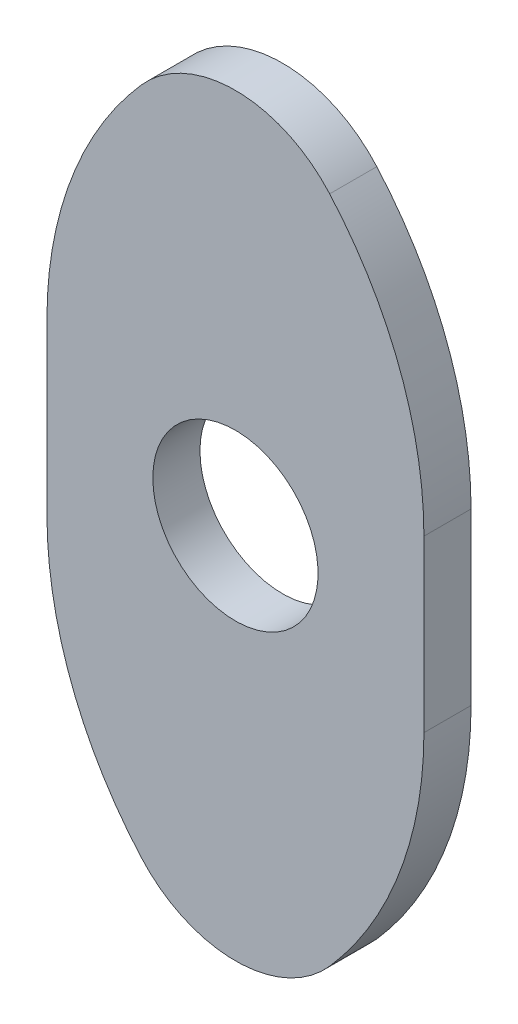
ISO-10303-21;
HEADER;
FILE_DESCRIPTION(('STEP AP214'),'2;1');
FILE_NAME('part.step','',(''),(''),'','','');
FILE_SCHEMA(('AUTOMOTIVE_DESIGN { 1 0 10303 214 1 1 1 1 }'));
ENDSEC;
DATA;
#1=APPLICATION_CONTEXT('core data for automotive mechanical design processes');
#2=APPLICATION_PROTOCOL_DEFINITION('international standard','automotive_design',2000,#1);
#3=PRODUCT_CONTEXT('',#1,'mechanical');
#4=PRODUCT('Part','Part','',(#3));
#5=PRODUCT_RELATED_PRODUCT_CATEGORY('part','',(#4));
#6=PRODUCT_DEFINITION_FORMATION('','',#4);
#7=PRODUCT_DEFINITION_CONTEXT('part definition',#1,'design');
#8=PRODUCT_DEFINITION('design','',#6,#7);
#9=PRODUCT_DEFINITION_SHAPE('','',#8);
#10=(LENGTH_UNIT() NAMED_UNIT(*) SI_UNIT(.MILLI.,.METRE.));
#11=(NAMED_UNIT(*) PLANE_ANGLE_UNIT() SI_UNIT($,.RADIAN.));
#12=(NAMED_UNIT(*) SI_UNIT($,.STERADIAN.) SOLID_ANGLE_UNIT());
#13=UNCERTAINTY_MEASURE_WITH_UNIT(LENGTH_MEASURE(1.E-05),#10,'distance_accuracy_value','');
#14=(GEOMETRIC_REPRESENTATION_CONTEXT(3) GLOBAL_UNCERTAINTY_ASSIGNED_CONTEXT((#13)) GLOBAL_UNIT_ASSIGNED_CONTEXT((#10,
#11,#12)) REPRESENTATION_CONTEXT('',''));
#15=CARTESIAN_POINT('',(0.,0.,0.));
#16=DIRECTION('',(0.,0.,1.));
#17=DIRECTION('',(1.,0.,0.));
#18=AXIS2_PLACEMENT_3D('',#15,#16,#17);
#19=CARTESIAN_POINT('',(-19.05,8.59947917473986,4.7625));
#20=DIRECTION('',(0.,0.,1.));
#21=DIRECTION('',(1.,0.,0.));
#22=AXIS2_PLACEMENT_3D('',#19,#20,#21);
#23=PLANE('',#22);
#24=CARTESIAN_POINT('',(-19.05,8.59947917473986,4.7625));
#25=DIRECTION('',(0.,0.,1.));
#26=DIRECTION('',(1.,0.,0.));
#27=AXIS2_PLACEMENT_3D('',#24,#25,#26);
#28=CIRCLE('',#27,38.1);
#29=CARTESIAN_POINT('',(19.05,8.59947917473985,4.7625));
#30=VERTEX_POINT('',#29);
#31=CARTESIAN_POINT('',(9.52500000000001,33.8002604126301,4.7625));
#32=VERTEX_POINT('',#31);
#33=EDGE_CURVE('E138',#30,#32,#28,.T.);
#34=ORIENTED_EDGE('',*,*,#33,.T.);
#35=CARTESIAN_POINT('',(0.,25.4,4.7625));
#36=DIRECTION('',(0.,0.,1.));
#37=DIRECTION('',(1.,0.,0.));
#38=AXIS2_PLACEMENT_3D('',#35,#36,#37);
#39=CIRCLE('',#38,12.7);
#40=CARTESIAN_POINT('',(-9.52500000000001,33.8002604126301,4.7625));
#41=VERTEX_POINT('',#40);
#42=EDGE_CURVE('E115',#32,#41,#39,.T.);
#43=ORIENTED_EDGE('',*,*,#42,.T.);
#44=CARTESIAN_POINT('',(19.05,8.59947917473986,4.7625));
#45=DIRECTION('',(0.,0.,1.));
#46=DIRECTION('',(-1.,0.,0.));
#47=AXIS2_PLACEMENT_3D('',#44,#45,#46);
#48=CIRCLE('',#47,38.1);
#49=CARTESIAN_POINT('',(-19.05,8.59947917473985,4.7625));
#50=VERTEX_POINT('',#49);
#51=EDGE_CURVE('E141',#41,#50,#48,.T.);
#52=ORIENTED_EDGE('',*,*,#51,.T.);
#53=DIRECTION('',(0.,-1.,0.));
#54=VECTOR('',#53,1.);
#55=CARTESIAN_POINT('',(-19.05,8.59947917473985,4.7625));
#56=LINE('',#55,#54);
#57=CARTESIAN_POINT('',(-19.05,-8.59947917473986,4.7625));
#58=VERTEX_POINT('',#57);
#59=EDGE_CURVE('E143',#50,#58,#56,.T.);
#60=ORIENTED_EDGE('',*,*,#59,.T.);
#61=CARTESIAN_POINT('',(19.05,-8.59947917473986,4.7625));
#62=DIRECTION('',(0.,0.,1.));
#63=DIRECTION('',(1.,0.,0.));
#64=AXIS2_PLACEMENT_3D('',#61,#62,#63);
#65=CIRCLE('',#64,38.1);
#66=CARTESIAN_POINT('',(-9.525,-33.8002604126301,4.7625));
#67=VERTEX_POINT('',#66);
#68=EDGE_CURVE('E145',#58,#67,#65,.T.);
#69=ORIENTED_EDGE('',*,*,#68,.T.);
#70=CARTESIAN_POINT('',(0.,-25.4,4.7625));
#71=DIRECTION('',(0.,0.,1.));
#72=DIRECTION('',(-1.,0.,0.));
#73=AXIS2_PLACEMENT_3D('',#70,#71,#72);
#74=CIRCLE('',#73,12.7);
#75=CARTESIAN_POINT('',(9.52500000000002,-33.8002604126301,4.7625));
#76=VERTEX_POINT('',#75);
#77=EDGE_CURVE('E147',#67,#76,#74,.T.);
#78=ORIENTED_EDGE('',*,*,#77,.T.);
#79=CARTESIAN_POINT('',(-19.05,-8.59947917473987,4.7625));
#80=DIRECTION('',(0.,0.,1.));
#81=DIRECTION('',(-1.,0.,0.));
#82=AXIS2_PLACEMENT_3D('',#79,#80,#81);
#83=CIRCLE('',#82,38.1);
#84=CARTESIAN_POINT('',(19.05,-8.59947917473985,4.7625));
#85=VERTEX_POINT('',#84);
#86=EDGE_CURVE('E56',#76,#85,#83,.T.);
#87=ORIENTED_EDGE('',*,*,#86,.T.);
#88=DIRECTION('',(0.,1.,0.));
#89=VECTOR('',#88,1.);
#90=CARTESIAN_POINT('',(19.05,8.59947917473985,4.7625));
#91=LINE('',#90,#89);
#92=EDGE_CURVE('E51',#85,#30,#91,.T.);
#93=ORIENTED_EDGE('',*,*,#92,.T.);
#94=EDGE_LOOP('',(#34,#43,#52,#60,#69,#78,#87,#93));
#95=FACE_BOUND('',#94,.T.);
#96=CARTESIAN_POINT('',(0.,0.,4.7625));
#97=DIRECTION('',(0.,0.,1.));
#98=DIRECTION('',(1.,0.,0.));
#99=AXIS2_PLACEMENT_3D('',#96,#97,#98);
#100=CIRCLE('',#99,8.35025);
#101=CARTESIAN_POINT('',(-8.35025,0.,4.7625));
#102=VERTEX_POINT('',#101);
#103=EDGE_CURVE('E120',#102,#102,#100,.T.);
#104=ORIENTED_EDGE('',*,*,#103,.F.);
#105=EDGE_LOOP('',(#104));
#106=FACE_BOUND('',#105,.T.);
#107=ADVANCED_FACE('F36',(#95,#106),#23,.T.);
#108=CARTESIAN_POINT('',(-19.05,8.59947917473986,0.));
#109=DIRECTION('',(0.,0.,1.));
#110=DIRECTION('',(1.,0.,0.));
#111=AXIS2_PLACEMENT_3D('',#108,#109,#110);
#112=PLANE('',#111);
#113=CARTESIAN_POINT('',(-19.05,8.59947917473986,0.));
#114=DIRECTION('',(0.,0.,1.));
#115=DIRECTION('',(1.,0.,0.));
#116=AXIS2_PLACEMENT_3D('',#113,#114,#115);
#117=CIRCLE('',#116,38.1);
#118=CARTESIAN_POINT('',(19.05,8.59947917473985,0.));
#119=VERTEX_POINT('',#118);
#120=CARTESIAN_POINT('',(9.52500000000001,33.8002604126301,0.));
#121=VERTEX_POINT('',#120);
#122=EDGE_CURVE('E106',#119,#121,#117,.T.);
#123=ORIENTED_EDGE('',*,*,#122,.F.);
#124=DIRECTION('',(0.,1.,0.));
#125=VECTOR('',#124,1.);
#126=CARTESIAN_POINT('',(19.05,8.59947917473985,0.));
#127=LINE('',#126,#125);
#128=CARTESIAN_POINT('',(19.05,-8.59947917473985,0.));
#129=VERTEX_POINT('',#128);
#130=EDGE_CURVE('E136',#129,#119,#127,.T.);
#131=ORIENTED_EDGE('',*,*,#130,.F.);
#132=CARTESIAN_POINT('',(-19.05,-8.59947917473987,0.));
#133=DIRECTION('',(0.,0.,1.));
#134=DIRECTION('',(-1.,0.,0.));
#135=AXIS2_PLACEMENT_3D('',#132,#133,#134);
#136=CIRCLE('',#135,38.1);
#137=CARTESIAN_POINT('',(9.52500000000002,-33.8002604126301,0.));
#138=VERTEX_POINT('',#137);
#139=EDGE_CURVE('E134',#138,#129,#136,.T.);
#140=ORIENTED_EDGE('',*,*,#139,.F.);
#141=CARTESIAN_POINT('',(0.,-25.4,0.));
#142=DIRECTION('',(0.,0.,1.));
#143=DIRECTION('',(-1.,0.,0.));
#144=AXIS2_PLACEMENT_3D('',#141,#142,#143);
#145=CIRCLE('',#144,12.7);
#146=CARTESIAN_POINT('',(-9.525,-33.8002604126301,0.));
#147=VERTEX_POINT('',#146);
#148=EDGE_CURVE('E132',#147,#138,#145,.T.);
#149=ORIENTED_EDGE('',*,*,#148,.F.);
#150=CARTESIAN_POINT('',(19.05,-8.59947917473986,0.));
#151=DIRECTION('',(0.,0.,1.));
#152=DIRECTION('',(1.,0.,0.));
#153=AXIS2_PLACEMENT_3D('',#150,#151,#152);
#154=CIRCLE('',#153,38.1);
#155=CARTESIAN_POINT('',(-19.05,-8.59947917473986,0.));
#156=VERTEX_POINT('',#155);
#157=EDGE_CURVE('E130',#156,#147,#154,.T.);
#158=ORIENTED_EDGE('',*,*,#157,.F.);
#159=DIRECTION('',(0.,-1.,0.));
#160=VECTOR('',#159,1.);
#161=CARTESIAN_POINT('',(-19.05,8.59947917473985,0.));
#162=LINE('',#161,#160);
#163=CARTESIAN_POINT('',(-19.05,8.59947917473985,0.));
#164=VERTEX_POINT('',#163);
#165=EDGE_CURVE('E128',#164,#156,#162,.T.);
#166=ORIENTED_EDGE('',*,*,#165,.F.);
#167=CARTESIAN_POINT('',(19.05,8.59947917473986,0.));
#168=DIRECTION('',(0.,0.,1.));
#169=DIRECTION('',(-1.,0.,0.));
#170=AXIS2_PLACEMENT_3D('',#167,#168,#169);
#171=CIRCLE('',#170,38.1);
#172=CARTESIAN_POINT('',(-9.52500000000001,33.8002604126301,0.));
#173=VERTEX_POINT('',#172);
#174=EDGE_CURVE('E108',#173,#164,#171,.T.);
#175=ORIENTED_EDGE('',*,*,#174,.F.);
#176=CARTESIAN_POINT('',(0.,25.4,0.));
#177=DIRECTION('',(0.,0.,1.));
#178=DIRECTION('',(1.,0.,0.));
#179=AXIS2_PLACEMENT_3D('',#176,#177,#178);
#180=CIRCLE('',#179,12.7);
#181=EDGE_CURVE('E101',#121,#173,#180,.T.);
#182=ORIENTED_EDGE('',*,*,#181,.F.);
#183=EDGE_LOOP('',(#123,#131,#140,#149,#158,#166,#175,#182));
#184=FACE_BOUND('',#183,.T.);
#185=CARTESIAN_POINT('',(0.,0.,0.));
#186=DIRECTION('',(0.,0.,1.));
#187=DIRECTION('',(1.,0.,0.));
#188=AXIS2_PLACEMENT_3D('',#185,#186,#187);
#189=CIRCLE('',#188,8.35025);
#190=CARTESIAN_POINT('',(-8.35025,0.,0.));
#191=VERTEX_POINT('',#190);
#192=EDGE_CURVE('E123',#191,#191,#189,.T.);
#193=ORIENTED_EDGE('',*,*,#192,.T.);
#194=EDGE_LOOP('',(#193));
#195=FACE_BOUND('',#194,.T.);
#196=ADVANCED_FACE('F102',(#184,#195),#112,.F.);
#197=CARTESIAN_POINT('',(-19.05,8.59947917473986,4.7625));
#198=DIRECTION('',(0.,0.,-1.));
#199=DIRECTION('',(-1.,0.,0.));
#200=AXIS2_PLACEMENT_3D('',#197,#198,#199);
#201=CYLINDRICAL_SURFACE('',#200,38.1);
#202=ORIENTED_EDGE('',*,*,#122,.T.);
#203=DIRECTION('',(0.,0.,-1.));
#204=VECTOR('',#203,1.);
#205=CARTESIAN_POINT('',(9.52500000000001,33.8002604126301,4.7625));
#206=LINE('',#205,#204);
#207=EDGE_CURVE('E11',#32,#121,#206,.T.);
#208=ORIENTED_EDGE('',*,*,#207,.F.);
#209=ORIENTED_EDGE('',*,*,#33,.F.);
#210=DIRECTION('',(0.,0.,-1.));
#211=VECTOR('',#210,1.);
#212=CARTESIAN_POINT('',(19.05,8.59947917473985,4.7625));
#213=LINE('',#212,#211);
#214=EDGE_CURVE('E119',#30,#119,#213,.T.);
#215=ORIENTED_EDGE('',*,*,#214,.T.);
#216=EDGE_LOOP('',(#202,#208,#209,#215));
#217=FACE_BOUND('',#216,.T.);
#218=ADVANCED_FACE('F38',(#217),#201,.T.);
#219=CARTESIAN_POINT('',(0.,25.4,4.7625));
#220=DIRECTION('',(0.,0.,-1.));
#221=DIRECTION('',(-1.,0.,0.));
#222=AXIS2_PLACEMENT_3D('',#219,#220,#221);
#223=CYLINDRICAL_SURFACE('',#222,12.7);
#224=ORIENTED_EDGE('',*,*,#181,.T.);
#225=DIRECTION('',(0.,0.,-1.));
#226=VECTOR('',#225,1.);
#227=CARTESIAN_POINT('',(-9.52500000000001,33.8002604126301,4.7625));
#228=LINE('',#227,#226);
#229=EDGE_CURVE('E44',#41,#173,#228,.T.);
#230=ORIENTED_EDGE('',*,*,#229,.F.);
#231=ORIENTED_EDGE('',*,*,#42,.F.);
#232=ORIENTED_EDGE('',*,*,#207,.T.);
#233=EDGE_LOOP('',(#224,#230,#231,#232));
#234=FACE_BOUND('',#233,.T.);
#235=ADVANCED_FACE('F114',(#234),#223,.T.);
#236=CARTESIAN_POINT('',(19.05,8.59947917473986,4.7625));
#237=DIRECTION('',(0.,0.,-1.));
#238=DIRECTION('',(-1.,0.,0.));
#239=AXIS2_PLACEMENT_3D('',#236,#237,#238);
#240=CYLINDRICAL_SURFACE('',#239,38.1);
#241=ORIENTED_EDGE('',*,*,#174,.T.);
#242=DIRECTION('',(0.,0.,-1.));
#243=VECTOR('',#242,1.);
#244=CARTESIAN_POINT('',(-19.05,8.59947917473985,4.7625));
#245=LINE('',#244,#243);
#246=EDGE_CURVE('E164',#50,#164,#245,.T.);
#247=ORIENTED_EDGE('',*,*,#246,.F.);
#248=ORIENTED_EDGE('',*,*,#51,.F.);
#249=ORIENTED_EDGE('',*,*,#229,.T.);
#250=EDGE_LOOP('',(#241,#247,#248,#249));
#251=FACE_BOUND('',#250,.T.);
#252=ADVANCED_FACE('F168',(#251),#240,.T.);
#253=CARTESIAN_POINT('',(-19.05,8.59947917473985,4.7625));
#254=DIRECTION('',(1.,0.,0.));
#255=DIRECTION('',(0.,0.,-1.));
#256=AXIS2_PLACEMENT_3D('',#253,#254,#255);
#257=PLANE('',#256);
#258=ORIENTED_EDGE('',*,*,#165,.T.);
#259=DIRECTION('',(0.,0.,-1.));
#260=VECTOR('',#259,1.);
#261=CARTESIAN_POINT('',(-19.05,-8.59947917473986,4.7625));
#262=LINE('',#261,#260);
#263=EDGE_CURVE('E161',#58,#156,#262,.T.);
#264=ORIENTED_EDGE('',*,*,#263,.F.);
#265=ORIENTED_EDGE('',*,*,#59,.F.);
#266=ORIENTED_EDGE('',*,*,#246,.T.);
#267=EDGE_LOOP('',(#258,#264,#265,#266));
#268=FACE_BOUND('',#267,.T.);
#269=ADVANCED_FACE('F176',(#268),#257,.F.);
#270=CARTESIAN_POINT('',(19.05,-8.59947917473986,4.7625));
#271=DIRECTION('',(0.,0.,-1.));
#272=DIRECTION('',(-1.,0.,0.));
#273=AXIS2_PLACEMENT_3D('',#270,#271,#272);
#274=CYLINDRICAL_SURFACE('',#273,38.1);
#275=ORIENTED_EDGE('',*,*,#157,.T.);
#276=DIRECTION('',(0.,0.,-1.));
#277=VECTOR('',#276,1.);
#278=CARTESIAN_POINT('',(-9.525,-33.8002604126301,4.7625));
#279=LINE('',#278,#277);
#280=EDGE_CURVE('E158',#67,#147,#279,.T.);
#281=ORIENTED_EDGE('',*,*,#280,.F.);
#282=ORIENTED_EDGE('',*,*,#68,.F.);
#283=ORIENTED_EDGE('',*,*,#263,.T.);
#284=EDGE_LOOP('',(#275,#281,#282,#283));
#285=FACE_BOUND('',#284,.T.);
#286=ADVANCED_FACE('F179',(#285),#274,.T.);
#287=CARTESIAN_POINT('',(0.,-25.4,4.7625));
#288=DIRECTION('',(0.,0.,-1.));
#289=DIRECTION('',(-1.,0.,0.));
#290=AXIS2_PLACEMENT_3D('',#287,#288,#289);
#291=CYLINDRICAL_SURFACE('',#290,12.7);
#292=ORIENTED_EDGE('',*,*,#148,.T.);
#293=DIRECTION('',(0.,0.,-1.));
#294=VECTOR('',#293,1.);
#295=CARTESIAN_POINT('',(9.52500000000002,-33.8002604126301,4.7625));
#296=LINE('',#295,#294);
#297=EDGE_CURVE('E155',#76,#138,#296,.T.);
#298=ORIENTED_EDGE('',*,*,#297,.F.);
#299=ORIENTED_EDGE('',*,*,#77,.F.);
#300=ORIENTED_EDGE('',*,*,#280,.T.);
#301=EDGE_LOOP('',(#292,#298,#299,#300));
#302=FACE_BOUND('',#301,.T.);
#303=ADVANCED_FACE('F184',(#302),#291,.T.);
#304=CARTESIAN_POINT('',(-19.05,-8.59947917473987,4.7625));
#305=DIRECTION('',(0.,0.,-1.));
#306=DIRECTION('',(-1.,0.,0.));
#307=AXIS2_PLACEMENT_3D('',#304,#305,#306);
#308=CYLINDRICAL_SURFACE('',#307,38.1);
#309=ORIENTED_EDGE('',*,*,#139,.T.);
#310=DIRECTION('',(0.,0.,-1.));
#311=VECTOR('',#310,1.);
#312=CARTESIAN_POINT('',(19.05,-8.59947917473985,4.7625));
#313=LINE('',#312,#311);
#314=EDGE_CURVE('E152',#85,#129,#313,.T.);
#315=ORIENTED_EDGE('',*,*,#314,.F.);
#316=ORIENTED_EDGE('',*,*,#86,.F.);
#317=ORIENTED_EDGE('',*,*,#297,.T.);
#318=EDGE_LOOP('',(#309,#315,#316,#317));
#319=FACE_BOUND('',#318,.T.);
#320=ADVANCED_FACE('F187',(#319),#308,.T.);
#321=CARTESIAN_POINT('',(19.05,8.59947917473985,4.7625));
#322=DIRECTION('',(-1.,0.,0.));
#323=DIRECTION('',(0.,0.,1.));
#324=AXIS2_PLACEMENT_3D('',#321,#322,#323);
#325=PLANE('',#324);
#326=ORIENTED_EDGE('',*,*,#130,.T.);
#327=ORIENTED_EDGE('',*,*,#214,.F.);
#328=ORIENTED_EDGE('',*,*,#92,.F.);
#329=ORIENTED_EDGE('',*,*,#314,.T.);
#330=EDGE_LOOP('',(#326,#327,#328,#329));
#331=FACE_BOUND('',#330,.T.);
#332=ADVANCED_FACE('F189',(#331),#325,.F.);
#333=CARTESIAN_POINT('',(0.,0.,4.7625));
#334=DIRECTION('',(0.,0.,-1.));
#335=DIRECTION('',(-1.,0.,0.));
#336=AXIS2_PLACEMENT_3D('',#333,#334,#335);
#337=CYLINDRICAL_SURFACE('',#336,8.35025);
#338=CARTESIAN_POINT('',(-8.35025,0.,4.7625));
#339=CARTESIAN_POINT('',(-8.35025,0.,4.712890625));
#340=CARTESIAN_POINT('',(-8.35025,0.,4.66328125));
#341=CARTESIAN_POINT('',(-8.35025,0.,4.5640625));
#342=CARTESIAN_POINT('',(-8.35025,0.,4.514453125));
#343=CARTESIAN_POINT('',(-8.35025,0.,4.415234375));
#344=CARTESIAN_POINT('',(-8.35025,0.,4.365625));
#345=CARTESIAN_POINT('',(-8.35025,0.,4.26640625));
#346=CARTESIAN_POINT('',(-8.35025,0.,4.216796875));
#347=CARTESIAN_POINT('',(-8.35025,0.,4.117578125));
#348=CARTESIAN_POINT('',(-8.35025,0.,4.06796875));
#349=CARTESIAN_POINT('',(-8.35025,0.,3.96875));
#350=CARTESIAN_POINT('',(-8.35025,0.,3.919140625));
#351=CARTESIAN_POINT('',(-8.35025,0.,3.819921875));
#352=CARTESIAN_POINT('',(-8.35025,0.,3.7703125));
#353=CARTESIAN_POINT('',(-8.35025,0.,3.67109375));
#354=CARTESIAN_POINT('',(-8.35025,0.,3.621484375));
#355=CARTESIAN_POINT('',(-8.35025,0.,3.522265625));
#356=CARTESIAN_POINT('',(-8.35025,0.,3.47265625));
#357=CARTESIAN_POINT('',(-8.35025,0.,3.3734375));
#358=CARTESIAN_POINT('',(-8.35025,0.,3.323828125));
#359=CARTESIAN_POINT('',(-8.35025,0.,3.224609375));
#360=CARTESIAN_POINT('',(-8.35025,0.,3.175));
#361=CARTESIAN_POINT('',(-8.35025,0.,3.07578125));
#362=CARTESIAN_POINT('',(-8.35025,0.,3.026171875));
#363=CARTESIAN_POINT('',(-8.35025,0.,2.926953125));
#364=CARTESIAN_POINT('',(-8.35025,0.,2.87734375));
#365=CARTESIAN_POINT('',(-8.35025,0.,2.778125));
#366=CARTESIAN_POINT('',(-8.35025,0.,2.728515625));
#367=CARTESIAN_POINT('',(-8.35025,0.,2.629296875));
#368=CARTESIAN_POINT('',(-8.35025,0.,2.5796875));
#369=CARTESIAN_POINT('',(-8.35025,0.,2.48046875));
#370=CARTESIAN_POINT('',(-8.35025,0.,2.430859375));
#371=CARTESIAN_POINT('',(-8.35025,0.,2.331640625));
#372=CARTESIAN_POINT('',(-8.35025,0.,2.28203125));
#373=CARTESIAN_POINT('',(-8.35025,0.,2.1828125));
#374=CARTESIAN_POINT('',(-8.35025,0.,2.133203125));
#375=CARTESIAN_POINT('',(-8.35025,0.,2.033984375));
#376=CARTESIAN_POINT('',(-8.35025,0.,1.984375));
#377=CARTESIAN_POINT('',(-8.35025,0.,1.88515625));
#378=CARTESIAN_POINT('',(-8.35025,0.,1.835546875));
#379=CARTESIAN_POINT('',(-8.35025,0.,1.736328125));
#380=CARTESIAN_POINT('',(-8.35025,0.,1.68671875));
#381=CARTESIAN_POINT('',(-8.35025,0.,1.5875));
#382=CARTESIAN_POINT('',(-8.35025,0.,1.537890625));
#383=CARTESIAN_POINT('',(-8.35025,0.,1.438671875));
#384=CARTESIAN_POINT('',(-8.35025,0.,1.3890625));
#385=CARTESIAN_POINT('',(-8.35025,0.,1.28984375));
#386=CARTESIAN_POINT('',(-8.35025,0.,1.240234375));
#387=CARTESIAN_POINT('',(-8.35025,0.,1.141015625));
#388=CARTESIAN_POINT('',(-8.35025,0.,1.09140625));
#389=CARTESIAN_POINT('',(-8.35025,0.,0.9921875));
#390=CARTESIAN_POINT('',(-8.35025,0.,0.942578125));
#391=CARTESIAN_POINT('',(-8.35025,0.,0.843359375));
#392=CARTESIAN_POINT('',(-8.35025,0.,0.79375));
#393=CARTESIAN_POINT('',(-8.35025,0.,0.69453125));
#394=CARTESIAN_POINT('',(-8.35025,0.,0.644921875));
#395=CARTESIAN_POINT('',(-8.35025,0.,0.545703125));
#396=CARTESIAN_POINT('',(-8.35025,0.,0.49609375));
#397=CARTESIAN_POINT('',(-8.35025,0.,0.396875));
#398=CARTESIAN_POINT('',(-8.35025,0.,0.347265625));
#399=CARTESIAN_POINT('',(-8.35025,0.,0.248046875));
#400=CARTESIAN_POINT('',(-8.35025,0.,0.1984375));
#401=CARTESIAN_POINT('',(-8.35025,0.,0.09921875));
#402=CARTESIAN_POINT('',(-8.35025,0.,0.049609375));
#403=CARTESIAN_POINT('',(-8.35025,0.,0.));
#404=B_SPLINE_CURVE_WITH_KNOTS('',3,(#338,#339,#340,#341,#342,#343,#344,#345,#346,#347,#348,
#349,#350,#351,#352,#353,#354,#355,#356,#357,#358,#359,#360,#361,#362,#363,#364,#365,#366,#367,
#368,#369,#370,#371,#372,#373,#374,#375,#376,#377,#378,#379,#380,#381,#382,#383,#384,#385,#386,
#387,#388,#389,#390,#391,#392,#393,#394,#395,#396,#397,#398,#399,#400,#401,#402,#403),
.UNSPECIFIED.,.F.,.F.,(4,2,2,2,2,2,2,2,2,2,2,2,2,2,2,2,2,2,2,2,2,2,2,2,2,2,2,2,2,2,2,2,4),(0.,
0.148828124999999,0.297656249999999,0.446484374999999,0.595312499999999,0.744140625,0.89296875,
1.041796875,1.190625,1.339453125,1.48828125,1.637109375,1.7859375,1.934765625,2.08359375,
2.232421875,2.38125,2.530078125,2.67890625,2.827734375,2.9765625,3.125390625,3.27421875,
3.423046875,3.571875,3.720703125,3.86953125,4.018359375,4.1671875,4.316015625,4.46484375,
4.613671875,4.7625),.UNSPECIFIED.);
#405=EDGE_CURVE('BSEAM191',#102,#191,#404,.T.);
#406=ORIENTED_EDGE('',*,*,#103,.T.);
#407=ORIENTED_EDGE('',*,*,#192,.F.);
#408=ORIENTED_EDGE('',*,*,#405,.T.);
#409=ORIENTED_EDGE('',*,*,#405,.F.);
#410=EDGE_LOOP('',(#406,#408,#407,#409));
#411=FACE_BOUND('',#410,.T.);
#412=ADVANCED_FACE('F191',(#411),#337,.F.);
#413=CLOSED_SHELL('',(#107,#196,#218,#235,#252,#269,#286,#303,#320,#332,#412));
#414=MANIFOLD_SOLID_BREP('B2',#413);
#415=ADVANCED_BREP_SHAPE_REPRESENTATION('',(#18,#414),#14);
#416=SHAPE_DEFINITION_REPRESENTATION(#9,#415);
ENDSEC;
END-ISO-10303-21;
